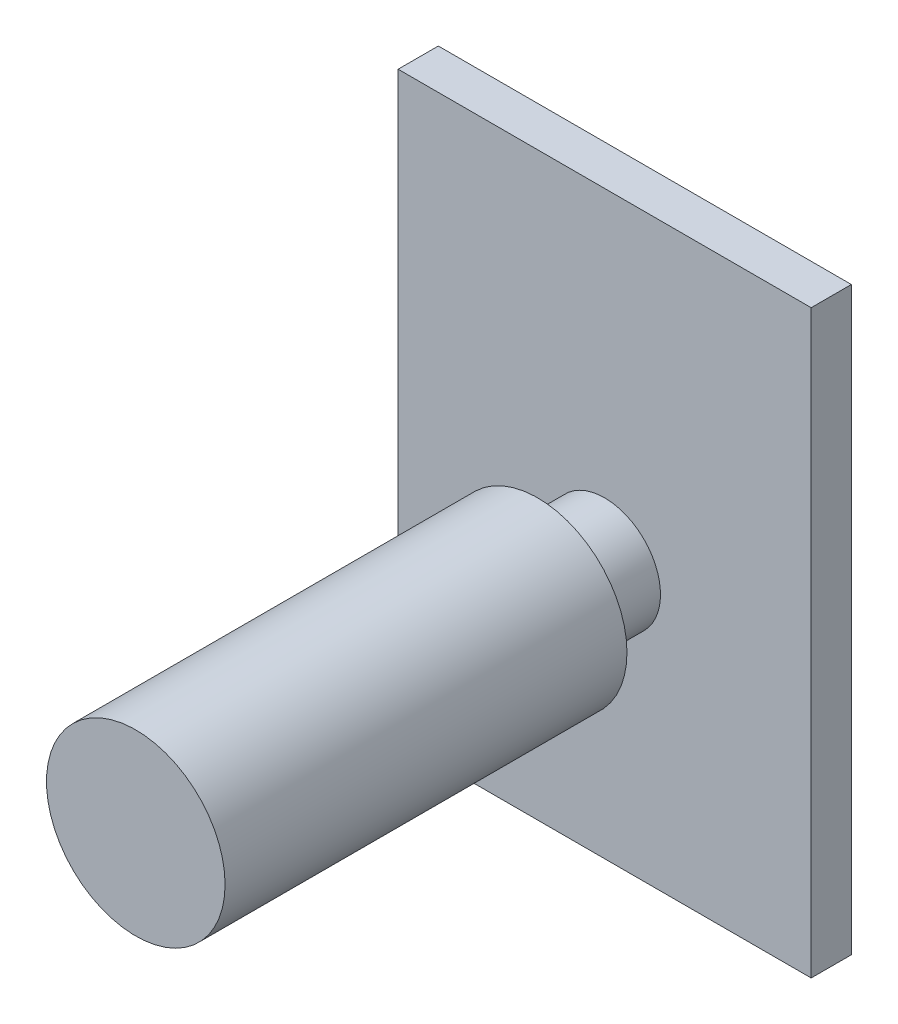
ISO-10303-21;
HEADER;
FILE_DESCRIPTION(('STEP AP214'),'2;1');
FILE_NAME('part.step','',(''),(''),'','','');
FILE_SCHEMA(('AUTOMOTIVE_DESIGN { 1 0 10303 214 1 1 1 1 }'));
ENDSEC;
DATA;
#1=APPLICATION_CONTEXT('core data for automotive mechanical design processes');
#2=APPLICATION_PROTOCOL_DEFINITION('international standard','automotive_design',2000,#1);
#3=PRODUCT_CONTEXT('',#1,'mechanical');
#4=PRODUCT('Part','Part','',(#3));
#5=PRODUCT_RELATED_PRODUCT_CATEGORY('part','',(#4));
#6=PRODUCT_DEFINITION_FORMATION('','',#4);
#7=PRODUCT_DEFINITION_CONTEXT('part definition',#1,'design');
#8=PRODUCT_DEFINITION('design','',#6,#7);
#9=PRODUCT_DEFINITION_SHAPE('','',#8);
#10=(LENGTH_UNIT() NAMED_UNIT(*) SI_UNIT(.MILLI.,.METRE.));
#11=(NAMED_UNIT(*) PLANE_ANGLE_UNIT() SI_UNIT($,.RADIAN.));
#12=(NAMED_UNIT(*) SI_UNIT($,.STERADIAN.) SOLID_ANGLE_UNIT());
#13=UNCERTAINTY_MEASURE_WITH_UNIT(LENGTH_MEASURE(1.E-05),#10,'distance_accuracy_value','');
#14=(GEOMETRIC_REPRESENTATION_CONTEXT(3) GLOBAL_UNCERTAINTY_ASSIGNED_CONTEXT((#13)) GLOBAL_UNIT_ASSIGNED_CONTEXT((#10,
#11,#12)) REPRESENTATION_CONTEXT('',''));
#15=CARTESIAN_POINT('',(0.,0.,0.));
#16=DIRECTION('',(0.,0.,1.));
#17=DIRECTION('',(1.,0.,0.));
#18=AXIS2_PLACEMENT_3D('',#15,#16,#17);
#19=CARTESIAN_POINT('',(9.25,-11.5,1.8));
#20=DIRECTION('',(-1.,0.,0.));
#21=DIRECTION('',(0.,-1.,0.));
#22=AXIS2_PLACEMENT_3D('',#19,#20,#21);
#23=PLANE('',#22);
#24=DIRECTION('',(0.,1.,0.));
#25=VECTOR('',#24,1.);
#26=CARTESIAN_POINT('',(9.25,-11.5,0.));
#27=LINE('',#26,#25);
#28=CARTESIAN_POINT('',(9.25,-11.5,0.));
#29=VERTEX_POINT('',#28);
#30=CARTESIAN_POINT('',(9.24999999999999,14.5,0.));
#31=VERTEX_POINT('',#30);
#32=EDGE_CURVE('E114',#29,#31,#27,.T.);
#33=ORIENTED_EDGE('',*,*,#32,.T.);
#34=DIRECTION('',(0.,0.,-1.));
#35=VECTOR('',#34,1.);
#36=CARTESIAN_POINT('',(9.24999999999999,14.5,1.8));
#37=LINE('',#36,#35);
#38=CARTESIAN_POINT('',(9.24999999999999,14.5,1.8));
#39=VERTEX_POINT('',#38);
#40=EDGE_CURVE('E52',#39,#31,#37,.T.);
#41=ORIENTED_EDGE('',*,*,#40,.F.);
#42=DIRECTION('',(0.,1.,0.));
#43=VECTOR('',#42,1.);
#44=CARTESIAN_POINT('',(9.25,-11.5,1.8));
#45=LINE('',#44,#43);
#46=CARTESIAN_POINT('',(9.25,-11.5,1.8));
#47=VERTEX_POINT('',#46);
#48=EDGE_CURVE('E96',#47,#39,#45,.T.);
#49=ORIENTED_EDGE('',*,*,#48,.F.);
#50=DIRECTION('',(0.,0.,-1.));
#51=VECTOR('',#50,1.);
#52=CARTESIAN_POINT('',(9.25,-11.5,1.8));
#53=LINE('',#52,#51);
#54=EDGE_CURVE('E110',#47,#29,#53,.T.);
#55=ORIENTED_EDGE('',*,*,#54,.T.);
#56=EDGE_LOOP('',(#33,#41,#49,#55));
#57=FACE_BOUND('',#56,.T.);
#58=ADVANCED_FACE('F43',(#57),#23,.F.);
#59=CARTESIAN_POINT('',(-9.25000000000001,14.5,1.8));
#60=DIRECTION('',(0.,-1.,0.));
#61=DIRECTION('',(1.,0.,0.));
#62=AXIS2_PLACEMENT_3D('',#59,#60,#61);
#63=PLANE('',#62);
#64=DIRECTION('',(-1.,0.,0.));
#65=VECTOR('',#64,1.);
#66=CARTESIAN_POINT('',(-9.25000000000001,14.5,0.));
#67=LINE('',#66,#65);
#68=CARTESIAN_POINT('',(-9.25000000000001,14.5,0.));
#69=VERTEX_POINT('',#68);
#70=EDGE_CURVE('E102',#31,#69,#67,.T.);
#71=ORIENTED_EDGE('',*,*,#70,.T.);
#72=DIRECTION('',(0.,0.,-1.));
#73=VECTOR('',#72,1.);
#74=CARTESIAN_POINT('',(-9.25000000000001,14.5,1.8));
#75=LINE('',#74,#73);
#76=CARTESIAN_POINT('',(-9.25000000000001,14.5,1.8));
#77=VERTEX_POINT('',#76);
#78=EDGE_CURVE('E100',#77,#69,#75,.T.);
#79=ORIENTED_EDGE('',*,*,#78,.F.);
#80=DIRECTION('',(-1.,0.,0.));
#81=VECTOR('',#80,1.);
#82=CARTESIAN_POINT('',(-9.25000000000001,14.5,1.8));
#83=LINE('',#82,#81);
#84=EDGE_CURVE('E91',#39,#77,#83,.T.);
#85=ORIENTED_EDGE('',*,*,#84,.F.);
#86=ORIENTED_EDGE('',*,*,#40,.T.);
#87=EDGE_LOOP('',(#71,#79,#85,#86));
#88=FACE_BOUND('',#87,.T.);
#89=ADVANCED_FACE('F101',(#88),#63,.F.);
#90=CARTESIAN_POINT('',(-9.25,-11.5,1.8));
#91=DIRECTION('',(1.,0.,0.));
#92=DIRECTION('',(0.,1.,0.));
#93=AXIS2_PLACEMENT_3D('',#90,#91,#92);
#94=PLANE('',#93);
#95=DIRECTION('',(0.,-1.,0.));
#96=VECTOR('',#95,1.);
#97=CARTESIAN_POINT('',(-9.25,-11.5,0.));
#98=LINE('',#97,#96);
#99=CARTESIAN_POINT('',(-9.25,-11.5,0.));
#100=VERTEX_POINT('',#99);
#101=EDGE_CURVE('E77',#69,#100,#98,.T.);
#102=ORIENTED_EDGE('',*,*,#101,.T.);
#103=DIRECTION('',(0.,0.,-1.));
#104=VECTOR('',#103,1.);
#105=CARTESIAN_POINT('',(-9.25,-11.5,1.8));
#106=LINE('',#105,#104);
#107=CARTESIAN_POINT('',(-9.25,-11.5,1.8));
#108=VERTEX_POINT('',#107);
#109=EDGE_CURVE('E104',#108,#100,#106,.T.);
#110=ORIENTED_EDGE('',*,*,#109,.F.);
#111=DIRECTION('',(0.,-1.,0.));
#112=VECTOR('',#111,1.);
#113=CARTESIAN_POINT('',(-9.25,-11.5,1.8));
#114=LINE('',#113,#112);
#115=EDGE_CURVE('E94',#77,#108,#114,.T.);
#116=ORIENTED_EDGE('',*,*,#115,.F.);
#117=ORIENTED_EDGE('',*,*,#78,.T.);
#118=EDGE_LOOP('',(#102,#110,#116,#117));
#119=FACE_BOUND('',#118,.T.);
#120=ADVANCED_FACE('F106',(#119),#94,.F.);
#121=CARTESIAN_POINT('',(-9.25,-11.5,1.8));
#122=DIRECTION('',(0.,1.,0.));
#123=DIRECTION('',(0.,0.,1.));
#124=AXIS2_PLACEMENT_3D('',#121,#122,#123);
#125=PLANE('',#124);
#126=DIRECTION('',(1.,0.,0.));
#127=VECTOR('',#126,1.);
#128=CARTESIAN_POINT('',(-9.25,-11.5,0.));
#129=LINE('',#128,#127);
#130=EDGE_CURVE('E83',#100,#29,#129,.T.);
#131=ORIENTED_EDGE('',*,*,#130,.T.);
#132=ORIENTED_EDGE('',*,*,#54,.F.);
#133=DIRECTION('',(1.,0.,0.));
#134=VECTOR('',#133,1.);
#135=CARTESIAN_POINT('',(-9.25,-11.5,1.8));
#136=LINE('',#135,#134);
#137=EDGE_CURVE('E60',#108,#47,#136,.T.);
#138=ORIENTED_EDGE('',*,*,#137,.F.);
#139=ORIENTED_EDGE('',*,*,#109,.T.);
#140=EDGE_LOOP('',(#131,#132,#138,#139));
#141=FACE_BOUND('',#140,.T.);
#142=ADVANCED_FACE('F143',(#141),#125,.F.);
#143=CARTESIAN_POINT('',(0.,0.,1.8));
#144=DIRECTION('',(0.,0.,-1.));
#145=DIRECTION('',(-1.,0.,0.));
#146=AXIS2_PLACEMENT_3D('',#143,#144,#145);
#147=PLANE('',#146);
#148=CARTESIAN_POINT('',(0.,0.,1.8));
#149=DIRECTION('',(0.,0.,-1.));
#150=DIRECTION('',(-1.,0.,0.));
#151=AXIS2_PLACEMENT_3D('',#148,#149,#150);
#152=CIRCLE('',#151,2.5);
#153=CARTESIAN_POINT('',(-2.5,0.,1.8));
#154=VERTEX_POINT('',#153);
#155=EDGE_CURVE('E11',#154,#154,#152,.F.);
#156=ORIENTED_EDGE('',*,*,#155,.F.);
#157=EDGE_LOOP('',(#156));
#158=FACE_BOUND('',#157,.T.);
#159=ORIENTED_EDGE('',*,*,#48,.T.);
#160=ORIENTED_EDGE('',*,*,#84,.T.);
#161=ORIENTED_EDGE('',*,*,#115,.T.);
#162=ORIENTED_EDGE('',*,*,#137,.T.);
#163=EDGE_LOOP('',(#159,#160,#161,#162));
#164=FACE_BOUND('',#163,.T.);
#165=ADVANCED_FACE('F92',(#158,#164),#147,.F.);
#166=CARTESIAN_POINT('',(0.,0.,0.));
#167=DIRECTION('',(0.,0.,-1.));
#168=DIRECTION('',(-1.,0.,0.));
#169=AXIS2_PLACEMENT_3D('',#166,#167,#168);
#170=PLANE('',#169);
#171=ORIENTED_EDGE('',*,*,#32,.F.);
#172=ORIENTED_EDGE('',*,*,#130,.F.);
#173=ORIENTED_EDGE('',*,*,#101,.F.);
#174=ORIENTED_EDGE('',*,*,#70,.F.);
#175=EDGE_LOOP('',(#171,#172,#173,#174));
#176=FACE_BOUND('',#175,.T.);
#177=ADVANCED_FACE('F132',(#176),#170,.T.);
#178=CARTESIAN_POINT('',(0.,0.,4.8));
#179=DIRECTION('',(0.,0.,-1.));
#180=DIRECTION('',(-1.,0.,0.));
#181=AXIS2_PLACEMENT_3D('',#178,#179,#180);
#182=CYLINDRICAL_SURFACE('',#181,2.5);
#183=CARTESIAN_POINT('',(0.,0.,4.8));
#184=DIRECTION('',(0.,0.,1.));
#185=DIRECTION('',(1.,0.,0.));
#186=AXIS2_PLACEMENT_3D('',#183,#184,#185);
#187=CIRCLE('',#186,2.5);
#188=CARTESIAN_POINT('',(2.5,0.,4.8));
#189=VERTEX_POINT('',#188);
#190=EDGE_CURVE('E118',#189,#189,#187,.T.);
#191=ORIENTED_EDGE('',*,*,#190,.F.);
#192=EDGE_LOOP('',(#191));
#193=FACE_BOUND('',#192,.T.);
#194=ORIENTED_EDGE('',*,*,#155,.T.);
#195=EDGE_LOOP('',(#194));
#196=FACE_BOUND('',#195,.T.);
#197=ADVANCED_FACE('F134',(#193,#196),#182,.T.);
#198=CARTESIAN_POINT('',(0.,0.,22.8));
#199=DIRECTION('',(0.,0.,-1.));
#200=DIRECTION('',(-1.,0.,0.));
#201=AXIS2_PLACEMENT_3D('',#198,#199,#200);
#202=CYLINDRICAL_SURFACE('',#201,4.);
#203=CARTESIAN_POINT('',(0.,0.,22.8));
#204=DIRECTION('',(0.,0.,1.));
#205=DIRECTION('',(1.,0.,0.));
#206=AXIS2_PLACEMENT_3D('',#203,#204,#205);
#207=CIRCLE('',#206,4.);
#208=CARTESIAN_POINT('',(4.,0.,22.8));
#209=VERTEX_POINT('',#208);
#210=EDGE_CURVE('E249',#209,#209,#207,.T.);
#211=ORIENTED_EDGE('',*,*,#210,.F.);
#212=EDGE_LOOP('',(#211));
#213=FACE_BOUND('',#212,.T.);
#214=CARTESIAN_POINT('',(0.,0.,4.8));
#215=DIRECTION('',(0.,0.,1.));
#216=DIRECTION('',(1.,0.,0.));
#217=AXIS2_PLACEMENT_3D('',#214,#215,#216);
#218=CIRCLE('',#217,4.);
#219=CARTESIAN_POINT('',(4.,0.,4.8));
#220=VERTEX_POINT('',#219);
#221=EDGE_CURVE('E246',#220,#220,#218,.T.);
#222=ORIENTED_EDGE('',*,*,#221,.T.);
#223=EDGE_LOOP('',(#222));
#224=FACE_BOUND('',#223,.T.);
#225=ADVANCED_FACE('F140',(#213,#224),#202,.T.);
#226=CARTESIAN_POINT('',(0.,0.,22.8));
#227=DIRECTION('',(0.,0.,1.));
#228=DIRECTION('',(1.,0.,0.));
#229=AXIS2_PLACEMENT_3D('',#226,#227,#228);
#230=PLANE('',#229);
#231=ORIENTED_EDGE('',*,*,#210,.T.);
#232=EDGE_LOOP('',(#231));
#233=FACE_BOUND('',#232,.T.);
#234=ADVANCED_FACE('F183',(#233),#230,.T.);
#235=CARTESIAN_POINT('',(0.,0.,4.8));
#236=DIRECTION('',(0.,0.,1.));
#237=DIRECTION('',(1.,0.,0.));
#238=AXIS2_PLACEMENT_3D('',#235,#236,#237);
#239=PLANE('',#238);
#240=ORIENTED_EDGE('',*,*,#190,.T.);
#241=EDGE_LOOP('',(#240));
#242=FACE_BOUND('',#241,.T.);
#243=ORIENTED_EDGE('',*,*,#221,.F.);
#244=EDGE_LOOP('',(#243));
#245=FACE_BOUND('',#244,.T.);
#246=ADVANCED_FACE('F194',(#242,#245),#239,.F.);
#247=CLOSED_SHELL('',(#58,#89,#120,#142,#165,#177,#197,#225,#234,#246));
#248=MANIFOLD_SOLID_BREP('B2',#247);
#249=ADVANCED_BREP_SHAPE_REPRESENTATION('',(#18,#248),#14);
#250=SHAPE_DEFINITION_REPRESENTATION(#9,#249);
ENDSEC;
END-ISO-10303-21;
